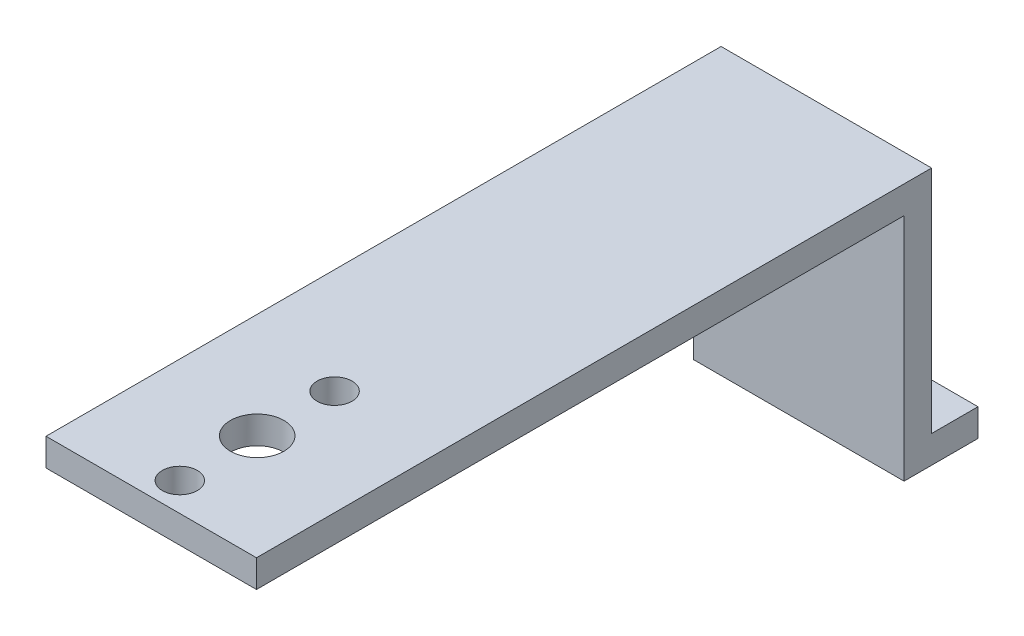
ISO-10303-21;
HEADER;
FILE_DESCRIPTION(('STEP AP214'),'2;1');
FILE_NAME('part.step','',(''),(''),'','','');
FILE_SCHEMA(('AUTOMOTIVE_DESIGN { 1 0 10303 214 1 1 1 1 }'));
ENDSEC;
DATA;
#1=APPLICATION_CONTEXT('core data for automotive mechanical design processes');
#2=APPLICATION_PROTOCOL_DEFINITION('international standard','automotive_design',2000,#1);
#3=PRODUCT_CONTEXT('',#1,'mechanical');
#4=PRODUCT('Part','Part','',(#3));
#5=PRODUCT_RELATED_PRODUCT_CATEGORY('part','',(#4));
#6=PRODUCT_DEFINITION_FORMATION('','',#4);
#7=PRODUCT_DEFINITION_CONTEXT('part definition',#1,'design');
#8=PRODUCT_DEFINITION('design','',#6,#7);
#9=PRODUCT_DEFINITION_SHAPE('','',#8);
#10=(LENGTH_UNIT() NAMED_UNIT(*) SI_UNIT(.MILLI.,.METRE.));
#11=(NAMED_UNIT(*) PLANE_ANGLE_UNIT() SI_UNIT($,.RADIAN.));
#12=(NAMED_UNIT(*) SI_UNIT($,.STERADIAN.) SOLID_ANGLE_UNIT());
#13=UNCERTAINTY_MEASURE_WITH_UNIT(LENGTH_MEASURE(1.E-05),#10,'distance_accuracy_value','');
#14=(GEOMETRIC_REPRESENTATION_CONTEXT(3) GLOBAL_UNCERTAINTY_ASSIGNED_CONTEXT((#13)) GLOBAL_UNIT_ASSIGNED_CONTEXT((#10,
#11,#12)) REPRESENTATION_CONTEXT('',''));
#15=CARTESIAN_POINT('',(0.,0.,0.));
#16=DIRECTION('',(0.,0.,1.));
#17=DIRECTION('',(1.,0.,0.));
#18=AXIS2_PLACEMENT_3D('',#15,#16,#17);
#19=CARTESIAN_POINT('',(-6.8,-12.733,0.88899999999999));
#20=DIRECTION('',(0.,-1.,0.));
#21=DIRECTION('',(0.,0.,-1.));
#22=AXIS2_PLACEMENT_3D('',#19,#20,#21);
#23=PLANE('',#22);
#24=DIRECTION('',(1.,0.,0.));
#25=VECTOR('',#24,1.);
#26=CARTESIAN_POINT('',(-6.8,-12.733,-3.88900000000001));
#27=LINE('',#26,#25);
#28=CARTESIAN_POINT('',(-6.8,-12.733,-3.88900000000001));
#29=VERTEX_POINT('',#28);
#30=CARTESIAN_POINT('',(6.8,-12.733,-3.88900000000001));
#31=VERTEX_POINT('',#30);
#32=EDGE_CURVE('E36',#29,#31,#27,.T.);
#33=ORIENTED_EDGE('',*,*,#32,.T.);
#34=DIRECTION('',(0.,0.,-1.));
#35=VECTOR('',#34,1.);
#36=CARTESIAN_POINT('',(6.8,-12.733,0.88899999999999));
#37=LINE('',#36,#35);
#38=CARTESIAN_POINT('',(6.8,-12.733,0.88899999999999));
#39=VERTEX_POINT('',#38);
#40=EDGE_CURVE('E97',#39,#31,#37,.T.);
#41=ORIENTED_EDGE('',*,*,#40,.F.);
#42=DIRECTION('',(1.,0.,0.));
#43=VECTOR('',#42,1.);
#44=CARTESIAN_POINT('',(-6.8,-12.733,0.88899999999999));
#45=LINE('',#44,#43);
#46=CARTESIAN_POINT('',(-6.8,-12.733,0.88899999999999));
#47=VERTEX_POINT('',#46);
#48=EDGE_CURVE('E11',#47,#39,#45,.T.);
#49=ORIENTED_EDGE('',*,*,#48,.F.);
#50=DIRECTION('',(0.,0.,-1.));
#51=VECTOR('',#50,1.);
#52=CARTESIAN_POINT('',(-6.8,-12.733,0.88899999999999));
#53=LINE('',#52,#51);
#54=EDGE_CURVE('E98',#47,#29,#53,.T.);
#55=ORIENTED_EDGE('',*,*,#54,.T.);
#56=EDGE_LOOP('',(#33,#41,#49,#55));
#57=FACE_BOUND('',#56,.T.);
#58=ADVANCED_FACE('F33',(#57),#23,.T.);
#59=CARTESIAN_POINT('',(-6.8,2.12499999999999,0.888999999999992));
#60=DIRECTION('',(0.,0.,1.));
#61=DIRECTION('',(0.,-1.,0.));
#62=AXIS2_PLACEMENT_3D('',#59,#60,#61);
#63=PLANE('',#62);
#64=ORIENTED_EDGE('',*,*,#48,.T.);
#65=DIRECTION('',(0.,-1.,0.));
#66=VECTOR('',#65,1.);
#67=CARTESIAN_POINT('',(6.8,2.12499999999999,0.888999999999992));
#68=LINE('',#67,#66);
#69=CARTESIAN_POINT('',(6.8,2.12499999999999,0.888999999999992));
#70=VERTEX_POINT('',#69);
#71=EDGE_CURVE('E115',#70,#39,#68,.T.);
#72=ORIENTED_EDGE('',*,*,#71,.F.);
#73=DIRECTION('',(1.,0.,0.));
#74=VECTOR('',#73,1.);
#75=CARTESIAN_POINT('',(-6.8,2.12499999999999,0.888999999999992));
#76=LINE('',#75,#74);
#77=CARTESIAN_POINT('',(-6.8,2.12499999999999,0.888999999999992));
#78=VERTEX_POINT('',#77);
#79=EDGE_CURVE('E41',#78,#70,#76,.T.);
#80=ORIENTED_EDGE('',*,*,#79,.F.);
#81=DIRECTION('',(0.,-1.,0.));
#82=VECTOR('',#81,1.);
#83=CARTESIAN_POINT('',(-6.8,2.12499999999999,0.888999999999992));
#84=LINE('',#83,#82);
#85=EDGE_CURVE('E103',#78,#47,#84,.T.);
#86=ORIENTED_EDGE('',*,*,#85,.T.);
#87=EDGE_LOOP('',(#64,#72,#80,#86));
#88=FACE_BOUND('',#87,.T.);
#89=ADVANCED_FACE('F184',(#88),#63,.T.);
#90=CARTESIAN_POINT('',(-6.8,2.12499999999999,0.888999999999992));
#91=DIRECTION('',(0.,-1.,0.));
#92=DIRECTION('',(0.,0.,-1.));
#93=AXIS2_PLACEMENT_3D('',#90,#91,#92);
#94=PLANE('',#93);
#95=CARTESIAN_POINT('',(0.,2.12499999999999,30.8857));
#96=DIRECTION('',(0.,-1.,0.));
#97=DIRECTION('',(0.,0.,-1.));
#98=AXIS2_PLACEMENT_3D('',#95,#96,#97);
#99=CIRCLE('',#98,1.1303);
#100=CARTESIAN_POINT('',(0.,2.12499999999999,29.7554));
#101=VERTEX_POINT('',#100);
#102=EDGE_CURVE('E230',#101,#101,#99,.F.);
#103=ORIENTED_EDGE('',*,*,#102,.T.);
#104=EDGE_LOOP('',(#103));
#105=FACE_BOUND('',#104,.T.);
#106=CARTESIAN_POINT('',(0.,2.12499999999999,35.8857));
#107=DIRECTION('',(0.,-1.,0.));
#108=DIRECTION('',(0.,0.,-1.));
#109=AXIS2_PLACEMENT_3D('',#106,#107,#108);
#110=CIRCLE('',#109,1.7272);
#111=CARTESIAN_POINT('',(0.,2.12499999999999,34.1585));
#112=VERTEX_POINT('',#111);
#113=EDGE_CURVE('E234',#112,#112,#110,.F.);
#114=ORIENTED_EDGE('',*,*,#113,.T.);
#115=EDGE_LOOP('',(#114));
#116=FACE_BOUND('',#115,.T.);
#117=CARTESIAN_POINT('',(0.,2.12499999999999,40.8857));
#118=DIRECTION('',(0.,-1.,0.));
#119=DIRECTION('',(0.,0.,-1.));
#120=AXIS2_PLACEMENT_3D('',#117,#118,#119);
#121=CIRCLE('',#120,1.1303);
#122=CARTESIAN_POINT('',(0.,2.12499999999999,39.7554));
#123=VERTEX_POINT('',#122);
#124=EDGE_CURVE('E119',#123,#123,#121,.F.);
#125=ORIENTED_EDGE('',*,*,#124,.T.);
#126=EDGE_LOOP('',(#125));
#127=FACE_BOUND('',#126,.T.);
#128=ORIENTED_EDGE('',*,*,#79,.T.);
#129=DIRECTION('',(0.,0.,-1.));
#130=VECTOR('',#129,1.);
#131=CARTESIAN_POINT('',(6.8,2.12499999999999,0.888999999999992));
#132=LINE('',#131,#130);
#133=CARTESIAN_POINT('',(6.8,2.12499999999999,42.731));
#134=VERTEX_POINT('',#133);
#135=EDGE_CURVE('E133',#134,#70,#132,.T.);
#136=ORIENTED_EDGE('',*,*,#135,.F.);
#137=DIRECTION('',(1.,0.,0.));
#138=VECTOR('',#137,1.);
#139=CARTESIAN_POINT('',(-6.8,2.12499999999999,42.731));
#140=LINE('',#139,#138);
#141=CARTESIAN_POINT('',(-6.8,2.12499999999999,42.731));
#142=VERTEX_POINT('',#141);
#143=EDGE_CURVE('E154',#142,#134,#140,.T.);
#144=ORIENTED_EDGE('',*,*,#143,.F.);
#145=DIRECTION('',(0.,0.,-1.));
#146=VECTOR('',#145,1.);
#147=CARTESIAN_POINT('',(-6.8,2.12499999999999,0.888999999999992));
#148=LINE('',#147,#146);
#149=EDGE_CURVE('E150',#142,#78,#148,.T.);
#150=ORIENTED_EDGE('',*,*,#149,.T.);
#151=EDGE_LOOP('',(#128,#136,#144,#150));
#152=FACE_BOUND('',#151,.T.);
#153=ADVANCED_FACE('F183',(#105,#116,#127,#152),#94,.T.);
#154=CARTESIAN_POINT('',(-6.8,3.90299999999999,42.731));
#155=DIRECTION('',(0.,0.,1.));
#156=DIRECTION('',(1.,0.,0.));
#157=AXIS2_PLACEMENT_3D('',#154,#155,#156);
#158=PLANE('',#157);
#159=ORIENTED_EDGE('',*,*,#143,.T.);
#160=DIRECTION('',(0.,-1.,0.));
#161=VECTOR('',#160,1.);
#162=CARTESIAN_POINT('',(6.8,3.90299999999999,42.731));
#163=LINE('',#162,#161);
#164=CARTESIAN_POINT('',(6.8,3.90299999999999,42.731));
#165=VERTEX_POINT('',#164);
#166=EDGE_CURVE('E130',#165,#134,#163,.T.);
#167=ORIENTED_EDGE('',*,*,#166,.F.);
#168=DIRECTION('',(1.,0.,0.));
#169=VECTOR('',#168,1.);
#170=CARTESIAN_POINT('',(-6.8,3.90299999999999,42.731));
#171=LINE('',#170,#169);
#172=CARTESIAN_POINT('',(-6.8,3.90299999999999,42.731));
#173=VERTEX_POINT('',#172);
#174=EDGE_CURVE('E156',#173,#165,#171,.T.);
#175=ORIENTED_EDGE('',*,*,#174,.F.);
#176=DIRECTION('',(0.,-1.,0.));
#177=VECTOR('',#176,1.);
#178=CARTESIAN_POINT('',(-6.8,3.90299999999999,42.731));
#179=LINE('',#178,#177);
#180=EDGE_CURVE('E147',#173,#142,#179,.T.);
#181=ORIENTED_EDGE('',*,*,#180,.T.);
#182=EDGE_LOOP('',(#159,#167,#175,#181));
#183=FACE_BOUND('',#182,.T.);
#184=ADVANCED_FACE('F179',(#183),#158,.T.);
#185=CARTESIAN_POINT('',(-6.8,3.903,0.888999999999999));
#186=DIRECTION('',(0.,1.,0.));
#187=DIRECTION('',(0.,0.,1.));
#188=AXIS2_PLACEMENT_3D('',#185,#186,#187);
#189=PLANE('',#188);
#190=CARTESIAN_POINT('',(0.,3.90299999999999,30.8857));
#191=DIRECTION('',(0.,1.,0.));
#192=DIRECTION('',(0.,0.,1.));
#193=AXIS2_PLACEMENT_3D('',#190,#191,#192);
#194=CIRCLE('',#193,1.1303);
#195=CARTESIAN_POINT('',(0.,3.90299999999999,32.016));
#196=VERTEX_POINT('',#195);
#197=EDGE_CURVE('E233',#196,#196,#194,.T.);
#198=ORIENTED_EDGE('',*,*,#197,.F.);
#199=EDGE_LOOP('',(#198));
#200=FACE_BOUND('',#199,.T.);
#201=CARTESIAN_POINT('',(0.,3.90299999999999,35.8857));
#202=DIRECTION('',(0.,1.,0.));
#203=DIRECTION('',(0.,0.,1.));
#204=AXIS2_PLACEMENT_3D('',#201,#202,#203);
#205=CIRCLE('',#204,1.7272);
#206=CARTESIAN_POINT('',(0.,3.90299999999999,37.6129));
#207=VERTEX_POINT('',#206);
#208=EDGE_CURVE('E237',#207,#207,#205,.T.);
#209=ORIENTED_EDGE('',*,*,#208,.F.);
#210=EDGE_LOOP('',(#209));
#211=FACE_BOUND('',#210,.T.);
#212=CARTESIAN_POINT('',(0.,3.90299999999999,40.8857));
#213=DIRECTION('',(0.,1.,0.));
#214=DIRECTION('',(0.,0.,1.));
#215=AXIS2_PLACEMENT_3D('',#212,#213,#214);
#216=CIRCLE('',#215,1.1303);
#217=CARTESIAN_POINT('',(0.,3.90299999999999,42.016));
#218=VERTEX_POINT('',#217);
#219=EDGE_CURVE('E116',#218,#218,#216,.T.);
#220=ORIENTED_EDGE('',*,*,#219,.F.);
#221=EDGE_LOOP('',(#220));
#222=FACE_BOUND('',#221,.T.);
#223=ORIENTED_EDGE('',*,*,#174,.T.);
#224=DIRECTION('',(0.,0.,1.));
#225=VECTOR('',#224,1.);
#226=CARTESIAN_POINT('',(6.8,3.903,-0.889000000000001));
#227=LINE('',#226,#225);
#228=CARTESIAN_POINT('',(6.8,3.903,-0.889000000000001));
#229=VERTEX_POINT('',#228);
#230=EDGE_CURVE('E127',#229,#165,#227,.T.);
#231=ORIENTED_EDGE('',*,*,#230,.F.);
#232=DIRECTION('',(1.,0.,0.));
#233=VECTOR('',#232,1.);
#234=CARTESIAN_POINT('',(-6.8,3.903,-0.889000000000001));
#235=LINE('',#234,#233);
#236=CARTESIAN_POINT('',(-6.8,3.903,-0.889000000000001));
#237=VERTEX_POINT('',#236);
#238=EDGE_CURVE('E158',#237,#229,#235,.T.);
#239=ORIENTED_EDGE('',*,*,#238,.F.);
#240=DIRECTION('',(0.,0.,1.));
#241=VECTOR('',#240,1.);
#242=CARTESIAN_POINT('',(-6.8,3.903,-0.889000000000001));
#243=LINE('',#242,#241);
#244=EDGE_CURVE('E145',#237,#173,#243,.T.);
#245=ORIENTED_EDGE('',*,*,#244,.T.);
#246=EDGE_LOOP('',(#223,#231,#239,#245));
#247=FACE_BOUND('',#246,.T.);
#248=ADVANCED_FACE('F171',(#200,#211,#222,#247),#189,.T.);
#249=CARTESIAN_POINT('',(-6.8,3.903,-0.889000000000001));
#250=DIRECTION('',(0.,0.,-1.));
#251=DIRECTION('',(0.,1.,0.));
#252=AXIS2_PLACEMENT_3D('',#249,#250,#251);
#253=PLANE('',#252);
#254=ORIENTED_EDGE('',*,*,#238,.T.);
#255=DIRECTION('',(0.,1.,0.));
#256=VECTOR('',#255,1.);
#257=CARTESIAN_POINT('',(6.8,3.903,-0.889000000000001));
#258=LINE('',#257,#256);
#259=CARTESIAN_POINT('',(6.8,-10.955,-0.88900000000001));
#260=VERTEX_POINT('',#259);
#261=EDGE_CURVE('E124',#260,#229,#258,.T.);
#262=ORIENTED_EDGE('',*,*,#261,.F.);
#263=DIRECTION('',(1.,0.,0.));
#264=VECTOR('',#263,1.);
#265=CARTESIAN_POINT('',(-6.8,-10.955,-0.88900000000001));
#266=LINE('',#265,#264);
#267=CARTESIAN_POINT('',(-6.8,-10.955,-0.88900000000001));
#268=VERTEX_POINT('',#267);
#269=EDGE_CURVE('E160',#268,#260,#266,.T.);
#270=ORIENTED_EDGE('',*,*,#269,.F.);
#271=DIRECTION('',(0.,1.,0.));
#272=VECTOR('',#271,1.);
#273=CARTESIAN_POINT('',(-6.8,3.903,-0.889000000000001));
#274=LINE('',#273,#272);
#275=EDGE_CURVE('E142',#268,#237,#274,.T.);
#276=ORIENTED_EDGE('',*,*,#275,.T.);
#277=EDGE_LOOP('',(#254,#262,#270,#276));
#278=FACE_BOUND('',#277,.T.);
#279=ADVANCED_FACE('F168',(#278),#253,.T.);
#280=CARTESIAN_POINT('',(-6.8,-10.955,-0.88900000000001));
#281=DIRECTION('',(0.,1.,0.));
#282=DIRECTION('',(0.,0.,1.));
#283=AXIS2_PLACEMENT_3D('',#280,#281,#282);
#284=PLANE('',#283);
#285=ORIENTED_EDGE('',*,*,#269,.T.);
#286=DIRECTION('',(0.,0.,1.));
#287=VECTOR('',#286,1.);
#288=CARTESIAN_POINT('',(6.8,-10.955,-0.88900000000001));
#289=LINE('',#288,#287);
#290=CARTESIAN_POINT('',(6.8,-10.955,-3.88900000000001));
#291=VERTEX_POINT('',#290);
#292=EDGE_CURVE('E110',#291,#260,#289,.T.);
#293=ORIENTED_EDGE('',*,*,#292,.F.);
#294=DIRECTION('',(1.,0.,0.));
#295=VECTOR('',#294,1.);
#296=CARTESIAN_POINT('',(-6.8,-10.955,-3.88900000000001));
#297=LINE('',#296,#295);
#298=CARTESIAN_POINT('',(-6.8,-10.955,-3.88900000000001));
#299=VERTEX_POINT('',#298);
#300=EDGE_CURVE('E102',#299,#291,#297,.T.);
#301=ORIENTED_EDGE('',*,*,#300,.F.);
#302=DIRECTION('',(0.,0.,1.));
#303=VECTOR('',#302,1.);
#304=CARTESIAN_POINT('',(-6.8,-10.955,-0.88900000000001));
#305=LINE('',#304,#303);
#306=EDGE_CURVE('E139',#299,#268,#305,.T.);
#307=ORIENTED_EDGE('',*,*,#306,.T.);
#308=EDGE_LOOP('',(#285,#293,#301,#307));
#309=FACE_BOUND('',#308,.T.);
#310=ADVANCED_FACE('F162',(#309),#284,.T.);
#311=CARTESIAN_POINT('',(-6.8,-12.733,-3.88900000000001));
#312=DIRECTION('',(0.,0.,-1.));
#313=DIRECTION('',(-1.,0.,0.));
#314=AXIS2_PLACEMENT_3D('',#311,#312,#313);
#315=PLANE('',#314);
#316=ORIENTED_EDGE('',*,*,#300,.T.);
#317=DIRECTION('',(0.,1.,0.));
#318=VECTOR('',#317,1.);
#319=CARTESIAN_POINT('',(6.8,-12.733,-3.88900000000001));
#320=LINE('',#319,#318);
#321=EDGE_CURVE('E105',#31,#291,#320,.T.);
#322=ORIENTED_EDGE('',*,*,#321,.F.);
#323=ORIENTED_EDGE('',*,*,#32,.F.);
#324=DIRECTION('',(0.,1.,0.));
#325=VECTOR('',#324,1.);
#326=CARTESIAN_POINT('',(-6.8,-12.733,-3.88900000000001));
#327=LINE('',#326,#325);
#328=EDGE_CURVE('E137',#29,#299,#327,.T.);
#329=ORIENTED_EDGE('',*,*,#328,.T.);
#330=EDGE_LOOP('',(#316,#322,#323,#329));
#331=FACE_BOUND('',#330,.T.);
#332=ADVANCED_FACE('F106',(#331),#315,.T.);
#333=CARTESIAN_POINT('',(-6.8,0.,0.));
#334=DIRECTION('',(1.,0.,0.));
#335=DIRECTION('',(0.,0.,-1.));
#336=AXIS2_PLACEMENT_3D('',#333,#334,#335);
#337=PLANE('',#336);
#338=ORIENTED_EDGE('',*,*,#54,.F.);
#339=ORIENTED_EDGE('',*,*,#85,.F.);
#340=ORIENTED_EDGE('',*,*,#149,.F.);
#341=ORIENTED_EDGE('',*,*,#180,.F.);
#342=ORIENTED_EDGE('',*,*,#244,.F.);
#343=ORIENTED_EDGE('',*,*,#275,.F.);
#344=ORIENTED_EDGE('',*,*,#306,.F.);
#345=ORIENTED_EDGE('',*,*,#328,.F.);
#346=EDGE_LOOP('',(#338,#339,#340,#341,#342,#343,#344,#345));
#347=FACE_BOUND('',#346,.T.);
#348=ADVANCED_FACE('F175',(#347),#337,.F.);
#349=CARTESIAN_POINT('',(6.8,0.,0.));
#350=DIRECTION('',(1.,0.,0.));
#351=DIRECTION('',(0.,0.,-1.));
#352=AXIS2_PLACEMENT_3D('',#349,#350,#351);
#353=PLANE('',#352);
#354=ORIENTED_EDGE('',*,*,#40,.T.);
#355=ORIENTED_EDGE('',*,*,#321,.T.);
#356=ORIENTED_EDGE('',*,*,#292,.T.);
#357=ORIENTED_EDGE('',*,*,#261,.T.);
#358=ORIENTED_EDGE('',*,*,#230,.T.);
#359=ORIENTED_EDGE('',*,*,#166,.T.);
#360=ORIENTED_EDGE('',*,*,#135,.T.);
#361=ORIENTED_EDGE('',*,*,#71,.T.);
#362=EDGE_LOOP('',(#354,#355,#356,#357,#358,#359,#360,#361));
#363=FACE_BOUND('',#362,.T.);
#364=ADVANCED_FACE('F113',(#363),#353,.T.);
#365=CARTESIAN_POINT('',(0.,-12.734,40.8857));
#366=DIRECTION('',(0.,1.,0.));
#367=DIRECTION('',(0.,0.,1.));
#368=AXIS2_PLACEMENT_3D('',#365,#366,#367);
#369=CYLINDRICAL_SURFACE('',#368,1.1303);
#370=ORIENTED_EDGE('',*,*,#124,.F.);
#371=EDGE_LOOP('',(#370));
#372=FACE_BOUND('',#371,.T.);
#373=ORIENTED_EDGE('',*,*,#219,.T.);
#374=EDGE_LOOP('',(#373));
#375=FACE_BOUND('',#374,.T.);
#376=ADVANCED_FACE('F211',(#372,#375),#369,.F.);
#377=CARTESIAN_POINT('',(0.,-12.734,35.8857));
#378=DIRECTION('',(0.,1.,0.));
#379=DIRECTION('',(0.,0.,1.));
#380=AXIS2_PLACEMENT_3D('',#377,#378,#379);
#381=CYLINDRICAL_SURFACE('',#380,1.7272);
#382=ORIENTED_EDGE('',*,*,#113,.F.);
#383=EDGE_LOOP('',(#382));
#384=FACE_BOUND('',#383,.T.);
#385=ORIENTED_EDGE('',*,*,#208,.T.);
#386=EDGE_LOOP('',(#385));
#387=FACE_BOUND('',#386,.T.);
#388=ADVANCED_FACE('F215',(#384,#387),#381,.F.);
#389=CARTESIAN_POINT('',(0.,-12.734,30.8857));
#390=DIRECTION('',(0.,1.,0.));
#391=DIRECTION('',(0.,0.,1.));
#392=AXIS2_PLACEMENT_3D('',#389,#390,#391);
#393=CYLINDRICAL_SURFACE('',#392,1.1303);
#394=ORIENTED_EDGE('',*,*,#102,.F.);
#395=EDGE_LOOP('',(#394));
#396=FACE_BOUND('',#395,.T.);
#397=ORIENTED_EDGE('',*,*,#197,.T.);
#398=EDGE_LOOP('',(#397));
#399=FACE_BOUND('',#398,.T.);
#400=ADVANCED_FACE('F221',(#396,#399),#393,.F.);
#401=CLOSED_SHELL('',(#58,#89,#153,#184,#248,#279,#310,#332,#348,#364,#376,#388,#400));
#402=MANIFOLD_SOLID_BREP('B2',#401);
#403=ADVANCED_BREP_SHAPE_REPRESENTATION('',(#18,#402),#14);
#404=SHAPE_DEFINITION_REPRESENTATION(#9,#403);
ENDSEC;
END-ISO-10303-21;
